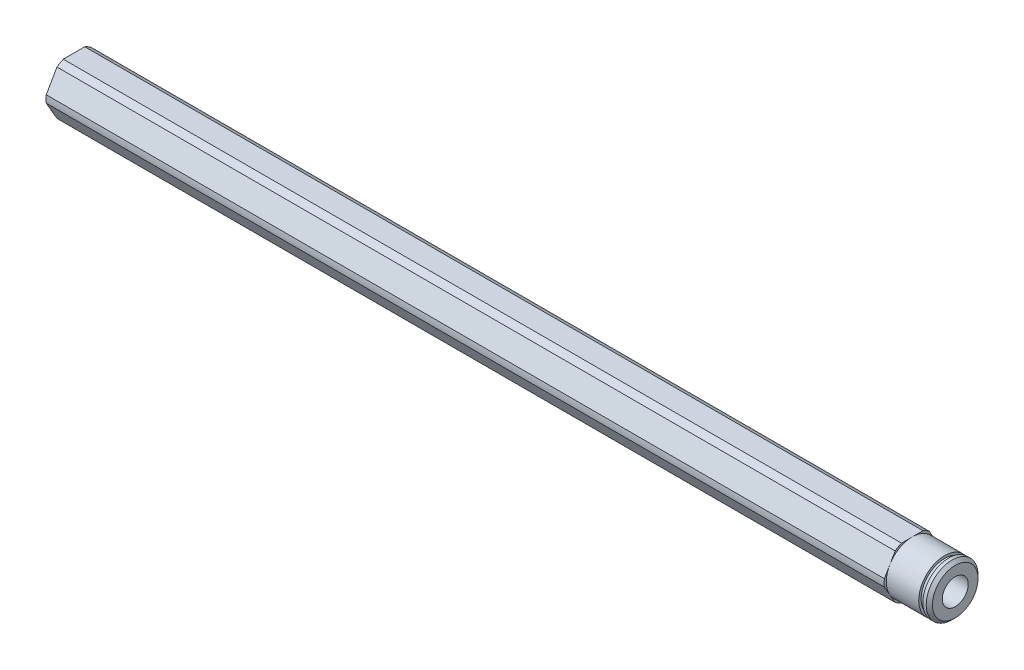
ISO-10303-21;
HEADER;
FILE_DESCRIPTION(('STEP AP214'),'2;1');
FILE_NAME('part.step','',(''),(''),'','','');
FILE_SCHEMA(('AUTOMOTIVE_DESIGN { 1 0 10303 214 1 1 1 1 }'));
ENDSEC;
DATA;
#1=APPLICATION_CONTEXT('core data for automotive mechanical design processes');
#2=APPLICATION_PROTOCOL_DEFINITION('international standard','automotive_design',2000,#1);
#3=PRODUCT_CONTEXT('',#1,'mechanical');
#4=PRODUCT('Part','Part','',(#3));
#5=PRODUCT_RELATED_PRODUCT_CATEGORY('part','',(#4));
#6=PRODUCT_DEFINITION_FORMATION('','',#4);
#7=PRODUCT_DEFINITION_CONTEXT('part definition',#1,'design');
#8=PRODUCT_DEFINITION('design','',#6,#7);
#9=PRODUCT_DEFINITION_SHAPE('','',#8);
#10=(LENGTH_UNIT() NAMED_UNIT(*) SI_UNIT(.MILLI.,.METRE.));
#11=(NAMED_UNIT(*) PLANE_ANGLE_UNIT() SI_UNIT($,.RADIAN.));
#12=(NAMED_UNIT(*) SI_UNIT($,.STERADIAN.) SOLID_ANGLE_UNIT());
#13=UNCERTAINTY_MEASURE_WITH_UNIT(LENGTH_MEASURE(1.E-05),#10,'distance_accuracy_value','');
#14=(GEOMETRIC_REPRESENTATION_CONTEXT(3) GLOBAL_UNCERTAINTY_ASSIGNED_CONTEXT((#13)) GLOBAL_UNIT_ASSIGNED_CONTEXT((#10,
#11,#12)) REPRESENTATION_CONTEXT('',''));
#15=CARTESIAN_POINT('',(0.,0.,0.));
#16=DIRECTION('',(0.,0.,1.));
#17=DIRECTION('',(1.,0.,0.));
#18=AXIS2_PLACEMENT_3D('',#15,#16,#17);
#19=CARTESIAN_POINT('',(-2.159,0.,0.));
#20=DIRECTION('',(1.,0.,0.));
#21=DIRECTION('',(0.,0.,-1.));
#22=AXIS2_PLACEMENT_3D('',#19,#20,#21);
#23=PLANE('',#22);
#24=CARTESIAN_POINT('',(-2.159,0.,0.));
#25=DIRECTION('',(1.,0.,0.));
#26=DIRECTION('',(0.,0.,-1.));
#27=AXIS2_PLACEMENT_3D('',#24,#25,#26);
#28=CIRCLE('',#27,3.175);
#29=CARTESIAN_POINT('',(-2.159,0.,-3.175));
#30=VERTEX_POINT('',#29);
#31=EDGE_CURVE('E20',#30,#30,#28,.T.);
#32=ORIENTED_EDGE('',*,*,#31,.T.);
#33=EDGE_LOOP('',(#32));
#34=FACE_BOUND('',#33,.T.);
#35=ADVANCED_FACE('F17',(#34),#23,.T.);
#36=CARTESIAN_POINT('',(-2.159,0.,0.));
#37=DIRECTION('',(1.,0.,0.));
#38=DIRECTION('',(0.,0.,-1.));
#39=AXIS2_PLACEMENT_3D('',#36,#37,#38);
#40=CYLINDRICAL_SURFACE('',#39,3.175);
#41=CARTESIAN_POINT('',(10.541,0.,0.));
#42=DIRECTION('',(1.,0.,0.));
#43=DIRECTION('',(0.,0.,-1.));
#44=AXIS2_PLACEMENT_3D('',#41,#42,#43);
#45=CIRCLE('',#44,3.175);
#46=CARTESIAN_POINT('',(10.541,0.,-3.175));
#47=VERTEX_POINT('',#46);
#48=EDGE_CURVE('E233',#47,#47,#45,.F.);
#49=ORIENTED_EDGE('',*,*,#48,.F.);
#50=EDGE_LOOP('',(#49));
#51=FACE_BOUND('',#50,.T.);
#52=ORIENTED_EDGE('',*,*,#31,.F.);
#53=EDGE_LOOP('',(#52));
#54=FACE_BOUND('',#53,.T.);
#55=ADVANCED_FACE('F241',(#51,#54),#40,.F.);
#56=CARTESIAN_POINT('',(10.541,0.,0.));
#57=DIRECTION('',(1.,0.,0.));
#58=DIRECTION('',(0.,0.,-1.));
#59=AXIS2_PLACEMENT_3D('',#56,#57,#58);
#60=PLANE('',#59);
#61=ORIENTED_EDGE('',*,*,#48,.T.);
#62=EDGE_LOOP('',(#61));
#63=FACE_BOUND('',#62,.T.);
#64=CARTESIAN_POINT('',(10.5410000000461,0.,0.));
#65=DIRECTION('',(-1.,0.,0.));
#66=DIRECTION('',(0.,0.,1.));
#67=AXIS2_PLACEMENT_3D('',#64,#65,#66);
#68=CIRCLE('',#67,5.58799999993198);
#69=CARTESIAN_POINT('',(10.5410000000461,0.,5.58799999993198));
#70=VERTEX_POINT('',#69);
#71=EDGE_CURVE('E176',#70,#70,#68,.T.);
#72=ORIENTED_EDGE('',*,*,#71,.F.);
#73=EDGE_LOOP('',(#72));
#74=FACE_BOUND('',#73,.T.);
#75=ADVANCED_FACE('F243',(#63,#74),#60,.T.);
#76=CARTESIAN_POINT('',(9.77900000009413,0.,0.));
#77=DIRECTION('',(-1.,0.,0.));
#78=DIRECTION('',(0.,0.,1.));
#79=AXIS2_PLACEMENT_3D('',#76,#77,#78);
#80=CONICAL_SURFACE('',#79,6.34999999988395,0.785398163397448);
#81=ORIENTED_EDGE('',*,*,#71,.T.);
#82=EDGE_LOOP('',(#81));
#83=FACE_BOUND('',#82,.T.);
#84=CARTESIAN_POINT('',(9.77899999999999,0.,0.));
#85=DIRECTION('',(-1.,0.,0.));
#86=DIRECTION('',(0.,0.,1.));
#87=AXIS2_PLACEMENT_3D('',#84,#85,#86);
#88=CIRCLE('',#87,6.35);
#89=CARTESIAN_POINT('',(9.77899999999999,0.,6.35));
#90=VERTEX_POINT('',#89);
#91=EDGE_CURVE('E172',#90,#90,#88,.T.);
#92=ORIENTED_EDGE('',*,*,#91,.F.);
#93=EDGE_LOOP('',(#92));
#94=FACE_BOUND('',#93,.T.);
#95=ADVANCED_FACE('F250',(#83,#94),#80,.T.);
#96=CARTESIAN_POINT('',(10.541,0.,0.));
#97=DIRECTION('',(-1.,0.,0.));
#98=DIRECTION('',(0.,0.,1.));
#99=AXIS2_PLACEMENT_3D('',#96,#97,#98);
#100=CYLINDRICAL_SURFACE('',#99,6.35);
#101=ORIENTED_EDGE('',*,*,#91,.T.);
#102=EDGE_LOOP('',(#101));
#103=FACE_BOUND('',#102,.T.);
#104=CARTESIAN_POINT('',(8.9535,0.,0.));
#105=DIRECTION('',(-1.,0.,0.));
#106=DIRECTION('',(0.,0.,1.));
#107=AXIS2_PLACEMENT_3D('',#104,#105,#106);
#108=CIRCLE('',#107,6.35);
#109=CARTESIAN_POINT('',(8.9535,0.,6.35));
#110=VERTEX_POINT('',#109);
#111=EDGE_CURVE('E175',#110,#110,#108,.F.);
#112=ORIENTED_EDGE('',*,*,#111,.T.);
#113=EDGE_LOOP('',(#112));
#114=FACE_BOUND('',#113,.T.);
#115=ADVANCED_FACE('F340',(#103,#114),#100,.T.);
#116=CARTESIAN_POINT('',(8.9535,0.,0.));
#117=DIRECTION('',(1.,0.,0.));
#118=DIRECTION('',(0.,0.,-1.));
#119=AXIS2_PLACEMENT_3D('',#116,#117,#118);
#120=PLANE('',#119);
#121=ORIENTED_EDGE('',*,*,#111,.F.);
#122=EDGE_LOOP('',(#121));
#123=FACE_BOUND('',#122,.T.);
#124=CARTESIAN_POINT('',(8.9535,0.,0.));
#125=DIRECTION('',(-1.,0.,0.));
#126=DIRECTION('',(0.,0.,1.));
#127=AXIS2_PLACEMENT_3D('',#124,#125,#126);
#128=CIRCLE('',#127,5.75);
#129=CARTESIAN_POINT('',(8.9535,0.,5.75));
#130=VERTEX_POINT('',#129);
#131=EDGE_CURVE('E227',#130,#130,#128,.T.);
#132=ORIENTED_EDGE('',*,*,#131,.F.);
#133=EDGE_LOOP('',(#132));
#134=FACE_BOUND('',#133,.T.);
#135=ADVANCED_FACE('F336',(#123,#134),#120,.F.);
#136=CARTESIAN_POINT('',(8.9535,0.,0.));
#137=DIRECTION('',(-1.,0.,0.));
#138=DIRECTION('',(0.,0.,1.));
#139=AXIS2_PLACEMENT_3D('',#136,#137,#138);
#140=CYLINDRICAL_SURFACE('',#139,5.75);
#141=CARTESIAN_POINT('',(7.9375,0.,0.));
#142=DIRECTION('',(-1.,0.,0.));
#143=DIRECTION('',(0.,0.,1.));
#144=AXIS2_PLACEMENT_3D('',#141,#142,#143);
#145=CIRCLE('',#144,5.75);
#146=CARTESIAN_POINT('',(7.9375,0.,5.75));
#147=VERTEX_POINT('',#146);
#148=EDGE_CURVE('E130',#147,#147,#145,.T.);
#149=ORIENTED_EDGE('',*,*,#148,.F.);
#150=EDGE_LOOP('',(#149));
#151=FACE_BOUND('',#150,.T.);
#152=ORIENTED_EDGE('',*,*,#131,.T.);
#153=EDGE_LOOP('',(#152));
#154=FACE_BOUND('',#153,.T.);
#155=ADVANCED_FACE('F332',(#151,#154),#140,.T.);
#156=CARTESIAN_POINT('',(0.,0.,0.));
#157=DIRECTION('',(-1.,0.,0.));
#158=DIRECTION('',(0.,0.,1.));
#159=AXIS2_PLACEMENT_3D('',#156,#157,#158);
#160=PLANE('',#159);
#161=DIRECTION('',(0.,0.,-1.));
#162=VECTOR('',#161,1.);
#163=CARTESIAN_POINT('',(0.,6.35000000000001,0.));
#164=LINE('',#163,#162);
#165=CARTESIAN_POINT('',(0.,6.35000000000001,-2.63498102459959));
#166=VERTEX_POINT('',#165);
#167=CARTESIAN_POINT('',(0.,6.35,0.));
#168=VERTEX_POINT('',#167);
#169=EDGE_CURVE('E129',#166,#168,#164,.F.);
#170=ORIENTED_EDGE('',*,*,#169,.T.);
#171=CARTESIAN_POINT('',(0.,0.,0.));
#172=DIRECTION('',(-1.,0.,0.));
#173=DIRECTION('',(0.,0.,1.));
#174=AXIS2_PLACEMENT_3D('',#171,#172,#173);
#175=CIRCLE('',#174,6.35);
#176=CARTESIAN_POINT('',(0.,3.175,-5.49926131403119));
#177=VERTEX_POINT('',#176);
#178=EDGE_CURVE('E218',#177,#168,#175,.F.);
#179=ORIENTED_EDGE('',*,*,#178,.F.);
#180=DIRECTION('',(0.,-0.866025403784439,-0.5));
#181=VECTOR('',#180,1.);
#182=CARTESIAN_POINT('',(0.,3.175,-5.49926131403119));
#183=LINE('',#182,#181);
#184=CARTESIAN_POINT('',(0.,5.45696050579321,-4.18177080173139));
#185=VERTEX_POINT('',#184);
#186=EDGE_CURVE('E164',#177,#185,#183,.F.);
#187=ORIENTED_EDGE('',*,*,#186,.T.);
#188=CARTESIAN_POINT('',(0.,0.,0.));
#189=DIRECTION('',(-1.,0.,0.));
#190=DIRECTION('',(0.,0.,1.));
#191=AXIS2_PLACEMENT_3D('',#188,#189,#190);
#192=CIRCLE('',#191,6.875);
#193=EDGE_CURVE('E165',#166,#185,#192,.T.);
#194=ORIENTED_EDGE('',*,*,#193,.F.);
#195=EDGE_LOOP('',(#170,#179,#187,#194));
#196=FACE_BOUND('',#195,.T.);
#197=ADVANCED_FACE('F329',(#196),#160,.F.);
#198=CARTESIAN_POINT('',(0.,0.,0.));
#199=DIRECTION('',(-1.,0.,0.));
#200=DIRECTION('',(0.,0.,1.));
#201=AXIS2_PLACEMENT_3D('',#198,#199,#200);
#202=PLANE('',#201);
#203=DIRECTION('',(0.,0.866025403784439,-0.5));
#204=VECTOR('',#203,1.);
#205=CARTESIAN_POINT('',(0.,3.175,5.49926131403118));
#206=LINE('',#205,#204);
#207=CARTESIAN_POINT('',(0.,5.45696050579321,4.18177080173138));
#208=VERTEX_POINT('',#207);
#209=CARTESIAN_POINT('',(0.,3.175,5.49926131403118));
#210=VERTEX_POINT('',#209);
#211=EDGE_CURVE('E122',#208,#210,#206,.F.);
#212=ORIENTED_EDGE('',*,*,#211,.T.);
#213=CARTESIAN_POINT('',(0.,0.,0.));
#214=DIRECTION('',(-1.,0.,0.));
#215=DIRECTION('',(0.,0.,1.));
#216=AXIS2_PLACEMENT_3D('',#213,#214,#215);
#217=CIRCLE('',#216,6.35);
#218=EDGE_CURVE('E215',#168,#210,#217,.F.);
#219=ORIENTED_EDGE('',*,*,#218,.F.);
#220=DIRECTION('',(0.,0.,-1.));
#221=VECTOR('',#220,1.);
#222=CARTESIAN_POINT('',(0.,6.35000000000001,0.));
#223=LINE('',#222,#221);
#224=CARTESIAN_POINT('',(0.,6.35000000000001,2.63498102459959));
#225=VERTEX_POINT('',#224);
#226=EDGE_CURVE('E124',#168,#225,#223,.F.);
#227=ORIENTED_EDGE('',*,*,#226,.T.);
#228=CARTESIAN_POINT('',(0.,0.,0.));
#229=DIRECTION('',(-1.,0.,0.));
#230=DIRECTION('',(0.,0.,1.));
#231=AXIS2_PLACEMENT_3D('',#228,#229,#230);
#232=CIRCLE('',#231,6.875);
#233=EDGE_CURVE('E118',#208,#225,#232,.T.);
#234=ORIENTED_EDGE('',*,*,#233,.F.);
#235=EDGE_LOOP('',(#212,#219,#227,#234));
#236=FACE_BOUND('',#235,.T.);
#237=ADVANCED_FACE('F120',(#236),#202,.F.);
#238=CARTESIAN_POINT('',(7.9375,0.,0.));
#239=DIRECTION('',(1.,0.,0.));
#240=DIRECTION('',(0.,0.,-1.));
#241=AXIS2_PLACEMENT_3D('',#238,#239,#240);
#242=PLANE('',#241);
#243=CARTESIAN_POINT('',(7.9375,0.,0.));
#244=DIRECTION('',(-1.,0.,0.));
#245=DIRECTION('',(0.,0.,1.));
#246=AXIS2_PLACEMENT_3D('',#243,#244,#245);
#247=CIRCLE('',#246,6.35);
#248=CARTESIAN_POINT('',(7.9375,0.,6.35));
#249=VERTEX_POINT('',#248);
#250=EDGE_CURVE('E212',#249,#249,#247,.T.);
#251=ORIENTED_EDGE('',*,*,#250,.F.);
#252=EDGE_LOOP('',(#251));
#253=FACE_BOUND('',#252,.T.);
#254=ORIENTED_EDGE('',*,*,#148,.T.);
#255=EDGE_LOOP('',(#254));
#256=FACE_BOUND('',#255,.T.);
#257=ADVANCED_FACE('F322',(#253,#256),#242,.T.);
#258=CARTESIAN_POINT('',(0.,0.,0.));
#259=DIRECTION('',(-1.,0.,0.));
#260=DIRECTION('',(0.,0.,1.));
#261=AXIS2_PLACEMENT_3D('',#258,#259,#260);
#262=PLANE('',#261);
#263=DIRECTION('',(0.,-0.866025403784439,-0.5));
#264=VECTOR('',#263,1.);
#265=CARTESIAN_POINT('',(0.,3.175,-5.49926131403119));
#266=LINE('',#265,#264);
#267=CARTESIAN_POINT('',(0.,0.893039494206796,-6.81675182633099));
#268=VERTEX_POINT('',#267);
#269=EDGE_CURVE('E161',#268,#177,#266,.F.);
#270=ORIENTED_EDGE('',*,*,#269,.T.);
#271=CARTESIAN_POINT('',(0.,0.,0.));
#272=DIRECTION('',(-1.,0.,0.));
#273=DIRECTION('',(0.,0.,1.));
#274=AXIS2_PLACEMENT_3D('',#271,#272,#273);
#275=CIRCLE('',#274,6.35);
#276=CARTESIAN_POINT('',(0.,-3.175,-5.49926131403119));
#277=VERTEX_POINT('',#276);
#278=EDGE_CURVE('E206',#277,#177,#275,.F.);
#279=ORIENTED_EDGE('',*,*,#278,.F.);
#280=DIRECTION('',(0.,-0.866025403784439,0.5));
#281=VECTOR('',#280,1.);
#282=CARTESIAN_POINT('',(0.,-3.175,-5.49926131403119));
#283=LINE('',#282,#281);
#284=CARTESIAN_POINT('',(0.,-0.893039494206809,-6.81675182633099));
#285=VERTEX_POINT('',#284);
#286=EDGE_CURVE('E156',#277,#285,#283,.F.);
#287=ORIENTED_EDGE('',*,*,#286,.T.);
#288=CARTESIAN_POINT('',(0.,0.,0.));
#289=DIRECTION('',(-1.,0.,0.));
#290=DIRECTION('',(0.,0.,1.));
#291=AXIS2_PLACEMENT_3D('',#288,#289,#290);
#292=CIRCLE('',#291,6.875);
#293=EDGE_CURVE('E157',#268,#285,#292,.T.);
#294=ORIENTED_EDGE('',*,*,#293,.F.);
#295=EDGE_LOOP('',(#270,#279,#287,#294));
#296=FACE_BOUND('',#295,.T.);
#297=ADVANCED_FACE('F318',(#296),#262,.F.);
#298=CARTESIAN_POINT('',(0.,0.,0.));
#299=DIRECTION('',(-1.,0.,0.));
#300=DIRECTION('',(0.,0.,1.));
#301=AXIS2_PLACEMENT_3D('',#298,#299,#300);
#302=PLANE('',#301);
#303=DIRECTION('',(0.,-0.866025403784439,0.5));
#304=VECTOR('',#303,1.);
#305=CARTESIAN_POINT('',(0.,-3.175,-5.49926131403119));
#306=LINE('',#305,#304);
#307=CARTESIAN_POINT('',(0.,-5.4569605057932,-4.18177080173139));
#308=VERTEX_POINT('',#307);
#309=EDGE_CURVE('E153',#308,#277,#306,.F.);
#310=ORIENTED_EDGE('',*,*,#309,.T.);
#311=CARTESIAN_POINT('',(0.,0.,0.));
#312=DIRECTION('',(-1.,0.,0.));
#313=DIRECTION('',(0.,0.,1.));
#314=AXIS2_PLACEMENT_3D('',#311,#312,#313);
#315=CIRCLE('',#314,6.35);
#316=CARTESIAN_POINT('',(0.,-6.35,0.));
#317=VERTEX_POINT('',#316);
#318=EDGE_CURVE('E209',#317,#277,#315,.F.);
#319=ORIENTED_EDGE('',*,*,#318,.F.);
#320=DIRECTION('',(0.,0.,1.));
#321=VECTOR('',#320,1.);
#322=CARTESIAN_POINT('',(0.,-6.35,0.));
#323=LINE('',#322,#321);
#324=CARTESIAN_POINT('',(0.,-6.35,-2.6349810245996));
#325=VERTEX_POINT('',#324);
#326=EDGE_CURVE('E208',#317,#325,#323,.F.);
#327=ORIENTED_EDGE('',*,*,#326,.T.);
#328=CARTESIAN_POINT('',(0.,0.,0.));
#329=DIRECTION('',(-1.,0.,0.));
#330=DIRECTION('',(0.,0.,1.));
#331=AXIS2_PLACEMENT_3D('',#328,#329,#330);
#332=CIRCLE('',#331,6.875);
#333=EDGE_CURVE('E145',#308,#325,#332,.T.);
#334=ORIENTED_EDGE('',*,*,#333,.F.);
#335=EDGE_LOOP('',(#310,#319,#327,#334));
#336=FACE_BOUND('',#335,.T.);
#337=ADVANCED_FACE('F315',(#336),#302,.F.);
#338=CARTESIAN_POINT('',(10.541,0.,0.));
#339=DIRECTION('',(-1.,0.,0.));
#340=DIRECTION('',(0.,0.,1.));
#341=AXIS2_PLACEMENT_3D('',#338,#339,#340);
#342=CYLINDRICAL_SURFACE('',#341,6.875);
#343=DIRECTION('',(1.,0.,0.));
#344=VECTOR('',#343,1.);
#345=CARTESIAN_POINT('',(-205.359,6.35000000000001,2.63498102459959));
#346=LINE('',#345,#344);
#347=CARTESIAN_POINT('',(-205.359,6.35000000000001,2.63498102459959));
#348=VERTEX_POINT('',#347);
#349=EDGE_CURVE('E151',#225,#348,#346,.F.);
#350=ORIENTED_EDGE('',*,*,#349,.T.);
#351=CARTESIAN_POINT('',(-205.359,0.,0.));
#352=DIRECTION('',(-1.,0.,0.));
#353=DIRECTION('',(0.,0.,1.));
#354=AXIS2_PLACEMENT_3D('',#351,#352,#353);
#355=CIRCLE('',#354,6.875);
#356=CARTESIAN_POINT('',(-205.359,5.45696050579321,4.18177080173138));
#357=VERTEX_POINT('',#356);
#358=EDGE_CURVE('E144',#357,#348,#355,.T.);
#359=ORIENTED_EDGE('',*,*,#358,.F.);
#360=DIRECTION('',(1.,0.,0.));
#361=VECTOR('',#360,1.);
#362=CARTESIAN_POINT('',(-205.359,5.45696050579321,4.18177080173138));
#363=LINE('',#362,#361);
#364=EDGE_CURVE('E135',#357,#208,#363,.T.);
#365=ORIENTED_EDGE('',*,*,#364,.T.);
#366=ORIENTED_EDGE('',*,*,#233,.T.);
#367=EDGE_LOOP('',(#350,#359,#365,#366));
#368=FACE_BOUND('',#367,.T.);
#369=ADVANCED_FACE('F143',(#368),#342,.T.);
#370=CARTESIAN_POINT('',(-205.359,6.35000000000001,0.));
#371=DIRECTION('',(0.,-1.,0.));
#372=DIRECTION('',(0.,0.,-1.));
#373=AXIS2_PLACEMENT_3D('',#370,#371,#372);
#374=PLANE('',#373);
#375=ORIENTED_EDGE('',*,*,#226,.F.);
#376=ORIENTED_EDGE('',*,*,#169,.F.);
#377=DIRECTION('',(-1.,0.,0.));
#378=VECTOR('',#377,1.);
#379=CARTESIAN_POINT('',(10.541,6.35000000000001,-2.63498102459959));
#380=LINE('',#379,#378);
#381=CARTESIAN_POINT('',(-205.359,6.35000000000001,-2.63498102459959));
#382=VERTEX_POINT('',#381);
#383=EDGE_CURVE('E223',#382,#166,#380,.F.);
#384=ORIENTED_EDGE('',*,*,#383,.F.);
#385=DIRECTION('',(0.,0.,1.));
#386=VECTOR('',#385,1.);
#387=CARTESIAN_POINT('',(-205.359,6.35000000000001,0.));
#388=LINE('',#387,#386);
#389=EDGE_CURVE('E203',#348,#382,#388,.F.);
#390=ORIENTED_EDGE('',*,*,#389,.F.);
#391=ORIENTED_EDGE('',*,*,#349,.F.);
#392=EDGE_LOOP('',(#375,#376,#384,#390,#391));
#393=FACE_BOUND('',#392,.T.);
#394=ADVANCED_FACE('F308',(#393),#374,.F.);
#395=CARTESIAN_POINT('',(10.541,0.,0.));
#396=DIRECTION('',(-1.,0.,0.));
#397=DIRECTION('',(0.,0.,1.));
#398=AXIS2_PLACEMENT_3D('',#395,#396,#397);
#399=CYLINDRICAL_SURFACE('',#398,6.875);
#400=DIRECTION('',(1.,0.,0.));
#401=VECTOR('',#400,1.);
#402=CARTESIAN_POINT('',(-205.359,5.45696050579321,-4.18177080173139));
#403=LINE('',#402,#401);
#404=CARTESIAN_POINT('',(-205.359,5.45696050579321,-4.18177080173139));
#405=VERTEX_POINT('',#404);
#406=EDGE_CURVE('E168',#185,#405,#403,.F.);
#407=ORIENTED_EDGE('',*,*,#406,.T.);
#408=CARTESIAN_POINT('',(-205.359,0.,0.));
#409=DIRECTION('',(-1.,0.,0.));
#410=DIRECTION('',(0.,0.,1.));
#411=AXIS2_PLACEMENT_3D('',#408,#409,#410);
#412=CIRCLE('',#411,6.875);
#413=EDGE_CURVE('E201',#382,#405,#412,.T.);
#414=ORIENTED_EDGE('',*,*,#413,.F.);
#415=ORIENTED_EDGE('',*,*,#383,.T.);
#416=ORIENTED_EDGE('',*,*,#193,.T.);
#417=EDGE_LOOP('',(#407,#414,#415,#416));
#418=FACE_BOUND('',#417,.T.);
#419=ADVANCED_FACE('F304',(#418),#399,.T.);
#420=CARTESIAN_POINT('',(-205.359,3.175,-5.49926131403119));
#421=DIRECTION('',(0.,-0.5,0.866025403784439));
#422=DIRECTION('',(0.,-0.866025403784439,-0.5));
#423=AXIS2_PLACEMENT_3D('',#420,#421,#422);
#424=PLANE('',#423);
#425=ORIENTED_EDGE('',*,*,#186,.F.);
#426=ORIENTED_EDGE('',*,*,#269,.F.);
#427=DIRECTION('',(-1.,0.,0.));
#428=VECTOR('',#427,1.);
#429=CARTESIAN_POINT('',(10.541,0.893039494206796,-6.81675182633099));
#430=LINE('',#429,#428);
#431=CARTESIAN_POINT('',(-205.359,0.893039494206795,-6.81675182633099));
#432=VERTEX_POINT('',#431);
#433=EDGE_CURVE('E222',#432,#268,#430,.F.);
#434=ORIENTED_EDGE('',*,*,#433,.F.);
#435=DIRECTION('',(0.,-0.866025403784439,-0.5));
#436=VECTOR('',#435,1.);
#437=CARTESIAN_POINT('',(-205.359,5.4569605057932,-4.18177080173139));
#438=LINE('',#437,#436);
#439=EDGE_CURVE('E200',#405,#432,#438,.T.);
#440=ORIENTED_EDGE('',*,*,#439,.F.);
#441=ORIENTED_EDGE('',*,*,#406,.F.);
#442=EDGE_LOOP('',(#425,#426,#434,#440,#441));
#443=FACE_BOUND('',#442,.T.);
#444=ADVANCED_FACE('F300',(#443),#424,.F.);
#445=CARTESIAN_POINT('',(10.541,0.,0.));
#446=DIRECTION('',(-1.,0.,0.));
#447=DIRECTION('',(0.,0.,1.));
#448=AXIS2_PLACEMENT_3D('',#445,#446,#447);
#449=CYLINDRICAL_SURFACE('',#448,6.875);
#450=DIRECTION('',(1.,0.,0.));
#451=VECTOR('',#450,1.);
#452=CARTESIAN_POINT('',(-205.359,-0.893039494206809,-6.81675182633099));
#453=LINE('',#452,#451);
#454=CARTESIAN_POINT('',(-205.359,-0.89303949420681,-6.81675182633099));
#455=VERTEX_POINT('',#454);
#456=EDGE_CURVE('E160',#285,#455,#453,.F.);
#457=ORIENTED_EDGE('',*,*,#456,.T.);
#458=CARTESIAN_POINT('',(-205.359,0.,0.));
#459=DIRECTION('',(-1.,0.,0.));
#460=DIRECTION('',(0.,0.,1.));
#461=AXIS2_PLACEMENT_3D('',#458,#459,#460);
#462=CIRCLE('',#461,6.875);
#463=EDGE_CURVE('E198',#432,#455,#462,.T.);
#464=ORIENTED_EDGE('',*,*,#463,.F.);
#465=ORIENTED_EDGE('',*,*,#433,.T.);
#466=ORIENTED_EDGE('',*,*,#293,.T.);
#467=EDGE_LOOP('',(#457,#464,#465,#466));
#468=FACE_BOUND('',#467,.T.);
#469=ADVANCED_FACE('F296',(#468),#449,.T.);
#470=CARTESIAN_POINT('',(-205.359,-3.175,-5.49926131403119));
#471=DIRECTION('',(0.,0.5,0.866025403784439));
#472=DIRECTION('',(0.,-0.866025403784439,0.5));
#473=AXIS2_PLACEMENT_3D('',#470,#471,#472);
#474=PLANE('',#473);
#475=ORIENTED_EDGE('',*,*,#286,.F.);
#476=ORIENTED_EDGE('',*,*,#309,.F.);
#477=DIRECTION('',(-1.,0.,0.));
#478=VECTOR('',#477,1.);
#479=CARTESIAN_POINT('',(10.541,-5.4569605057932,-4.1817708017314));
#480=LINE('',#479,#478);
#481=CARTESIAN_POINT('',(-205.359,-5.4569605057932,-4.18177080173139));
#482=VERTEX_POINT('',#481);
#483=EDGE_CURVE('E147',#482,#308,#480,.F.);
#484=ORIENTED_EDGE('',*,*,#483,.F.);
#485=DIRECTION('',(0.,-0.866025403784438,0.5));
#486=VECTOR('',#485,1.);
#487=CARTESIAN_POINT('',(-205.359,-0.89303949420681,-6.81675182633099));
#488=LINE('',#487,#486);
#489=EDGE_CURVE('E197',#455,#482,#488,.T.);
#490=ORIENTED_EDGE('',*,*,#489,.F.);
#491=ORIENTED_EDGE('',*,*,#456,.F.);
#492=EDGE_LOOP('',(#475,#476,#484,#490,#491));
#493=FACE_BOUND('',#492,.T.);
#494=ADVANCED_FACE('F292',(#493),#474,.F.);
#495=CARTESIAN_POINT('',(10.541,0.,0.));
#496=DIRECTION('',(-1.,0.,0.));
#497=DIRECTION('',(0.,0.,1.));
#498=AXIS2_PLACEMENT_3D('',#495,#496,#497);
#499=CYLINDRICAL_SURFACE('',#498,6.875);
#500=DIRECTION('',(1.,0.,0.));
#501=VECTOR('',#500,1.);
#502=CARTESIAN_POINT('',(-205.359,-6.35,-2.6349810245996));
#503=LINE('',#502,#501);
#504=CARTESIAN_POINT('',(-205.359,-6.35,-2.6349810245996));
#505=VERTEX_POINT('',#504);
#506=EDGE_CURVE('E545',#325,#505,#503,.F.);
#507=ORIENTED_EDGE('',*,*,#506,.T.);
#508=CARTESIAN_POINT('',(-205.359,0.,0.));
#509=DIRECTION('',(-1.,0.,0.));
#510=DIRECTION('',(0.,0.,1.));
#511=AXIS2_PLACEMENT_3D('',#508,#509,#510);
#512=CIRCLE('',#511,6.875);
#513=EDGE_CURVE('E195',#482,#505,#512,.T.);
#514=ORIENTED_EDGE('',*,*,#513,.F.);
#515=ORIENTED_EDGE('',*,*,#483,.T.);
#516=ORIENTED_EDGE('',*,*,#333,.T.);
#517=EDGE_LOOP('',(#507,#514,#515,#516));
#518=FACE_BOUND('',#517,.T.);
#519=ADVANCED_FACE('F289',(#518),#499,.T.);
#520=CARTESIAN_POINT('',(-205.359,3.175,5.49926131403118));
#521=DIRECTION('',(0.,-0.5,-0.866025403784439));
#522=DIRECTION('',(0.,0.866025403784439,-0.5));
#523=AXIS2_PLACEMENT_3D('',#520,#521,#522);
#524=PLANE('',#523);
#525=DIRECTION('',(0.,0.866025403784438,-0.500000000000001));
#526=VECTOR('',#525,1.);
#527=CARTESIAN_POINT('',(0.,0.893039494206791,6.81675182633099));
#528=LINE('',#527,#526);
#529=CARTESIAN_POINT('',(0.,0.893039494206794,6.81675182633099));
#530=VERTEX_POINT('',#529);
#531=EDGE_CURVE('E139',#530,#210,#528,.T.);
#532=ORIENTED_EDGE('',*,*,#531,.T.);
#533=ORIENTED_EDGE('',*,*,#211,.F.);
#534=ORIENTED_EDGE('',*,*,#364,.F.);
#535=DIRECTION('',(0.,0.866025403784438,-0.5));
#536=VECTOR('',#535,1.);
#537=CARTESIAN_POINT('',(-205.359,0.893039494206791,6.81675182633099));
#538=LINE('',#537,#536);
#539=CARTESIAN_POINT('',(-205.359,0.893039494206793,6.81675182633099));
#540=VERTEX_POINT('',#539);
#541=EDGE_CURVE('E205',#540,#357,#538,.T.);
#542=ORIENTED_EDGE('',*,*,#541,.F.);
#543=DIRECTION('',(1.,0.,0.));
#544=VECTOR('',#543,1.);
#545=CARTESIAN_POINT('',(-205.359,0.893039494206789,6.81675182633099));
#546=LINE('',#545,#544);
#547=EDGE_CURVE('E140',#530,#540,#546,.F.);
#548=ORIENTED_EDGE('',*,*,#547,.F.);
#549=EDGE_LOOP('',(#532,#533,#534,#542,#548));
#550=FACE_BOUND('',#549,.T.);
#551=ADVANCED_FACE('F133',(#550),#524,.F.);
#552=CARTESIAN_POINT('',(7.9375,0.,0.));
#553=DIRECTION('',(-1.,0.,0.));
#554=DIRECTION('',(0.,0.,1.));
#555=AXIS2_PLACEMENT_3D('',#552,#553,#554);
#556=CYLINDRICAL_SURFACE('',#555,6.35);
#557=ORIENTED_EDGE('',*,*,#250,.T.);
#558=EDGE_LOOP('',(#557));
#559=FACE_BOUND('',#558,.T.);
#560=ORIENTED_EDGE('',*,*,#318,.T.);
#561=ORIENTED_EDGE('',*,*,#278,.T.);
#562=ORIENTED_EDGE('',*,*,#178,.T.);
#563=ORIENTED_EDGE('',*,*,#218,.T.);
#564=CARTESIAN_POINT('',(0.,0.,0.));
#565=DIRECTION('',(-1.,0.,0.));
#566=DIRECTION('',(0.,0.,1.));
#567=AXIS2_PLACEMENT_3D('',#564,#565,#566);
#568=CIRCLE('',#567,6.35);
#569=CARTESIAN_POINT('',(0.,-3.175,5.49926131403119));
#570=VERTEX_POINT('',#569);
#571=EDGE_CURVE('E189',#210,#570,#568,.F.);
#572=ORIENTED_EDGE('',*,*,#571,.T.);
#573=CARTESIAN_POINT('',(0.,0.,0.));
#574=DIRECTION('',(-1.,0.,0.));
#575=DIRECTION('',(0.,0.,1.));
#576=AXIS2_PLACEMENT_3D('',#573,#574,#575);
#577=CIRCLE('',#576,6.35);
#578=EDGE_CURVE('E183',#570,#317,#577,.F.);
#579=ORIENTED_EDGE('',*,*,#578,.T.);
#580=EDGE_LOOP('',(#560,#561,#562,#563,#572,#579));
#581=FACE_BOUND('',#580,.T.);
#582=ADVANCED_FACE('F282',(#559,#581),#556,.T.);
#583=CARTESIAN_POINT('',(-205.359,-6.35,0.));
#584=DIRECTION('',(0.,1.,0.));
#585=DIRECTION('',(0.,0.,1.));
#586=AXIS2_PLACEMENT_3D('',#583,#584,#585);
#587=PLANE('',#586);
#588=ORIENTED_EDGE('',*,*,#326,.F.);
#589=DIRECTION('',(0.,0.,1.));
#590=VECTOR('',#589,1.);
#591=CARTESIAN_POINT('',(0.,-6.35,0.));
#592=LINE('',#591,#590);
#593=CARTESIAN_POINT('',(0.,-6.35,2.6349810245996));
#594=VERTEX_POINT('',#593);
#595=EDGE_CURVE('E186',#317,#594,#592,.T.);
#596=ORIENTED_EDGE('',*,*,#595,.T.);
#597=DIRECTION('',(-1.,0.,0.));
#598=VECTOR('',#597,1.);
#599=CARTESIAN_POINT('',(10.541,-6.35,2.6349810245996));
#600=LINE('',#599,#598);
#601=CARTESIAN_POINT('',(-205.359,-6.35,2.6349810245996));
#602=VERTEX_POINT('',#601);
#603=EDGE_CURVE('E182',#602,#594,#600,.F.);
#604=ORIENTED_EDGE('',*,*,#603,.F.);
#605=DIRECTION('',(0.,0.,1.));
#606=VECTOR('',#605,1.);
#607=CARTESIAN_POINT('',(-205.359,-6.35,0.));
#608=LINE('',#607,#606);
#609=EDGE_CURVE('E194',#505,#602,#608,.T.);
#610=ORIENTED_EDGE('',*,*,#609,.F.);
#611=ORIENTED_EDGE('',*,*,#506,.F.);
#612=EDGE_LOOP('',(#588,#596,#604,#610,#611));
#613=FACE_BOUND('',#612,.T.);
#614=ADVANCED_FACE('F278',(#613),#587,.F.);
#615=CARTESIAN_POINT('',(-205.359,0.,0.));
#616=DIRECTION('',(-1.,0.,0.));
#617=DIRECTION('',(0.,0.,1.));
#618=AXIS2_PLACEMENT_3D('',#615,#616,#617);
#619=PLANE('',#618);
#620=CARTESIAN_POINT('',(-205.359,0.,0.));
#621=DIRECTION('',(-1.,0.,0.));
#622=DIRECTION('',(0.,0.,1.));
#623=AXIS2_PLACEMENT_3D('',#620,#621,#622);
#624=CIRCLE('',#623,6.875);
#625=CARTESIAN_POINT('',(-205.359,-0.893039494206788,6.81675182633099));
#626=VERTEX_POINT('',#625);
#627=EDGE_CURVE('E192',#540,#626,#624,.F.);
#628=ORIENTED_EDGE('',*,*,#627,.F.);
#629=ORIENTED_EDGE('',*,*,#541,.T.);
#630=ORIENTED_EDGE('',*,*,#358,.T.);
#631=ORIENTED_EDGE('',*,*,#389,.T.);
#632=ORIENTED_EDGE('',*,*,#413,.T.);
#633=ORIENTED_EDGE('',*,*,#439,.T.);
#634=ORIENTED_EDGE('',*,*,#463,.T.);
#635=ORIENTED_EDGE('',*,*,#489,.T.);
#636=ORIENTED_EDGE('',*,*,#513,.T.);
#637=ORIENTED_EDGE('',*,*,#609,.T.);
#638=CARTESIAN_POINT('',(-205.359,0.,0.));
#639=DIRECTION('',(-1.,0.,0.));
#640=DIRECTION('',(0.,0.,1.));
#641=AXIS2_PLACEMENT_3D('',#638,#639,#640);
#642=CIRCLE('',#641,6.875);
#643=CARTESIAN_POINT('',(-205.359,-5.45696050579321,4.18177080173138));
#644=VERTEX_POINT('',#643);
#645=EDGE_CURVE('E177',#644,#602,#642,.F.);
#646=ORIENTED_EDGE('',*,*,#645,.F.);
#647=DIRECTION('',(0.,0.866025403784439,0.5));
#648=VECTOR('',#647,1.);
#649=CARTESIAN_POINT('',(-205.359,-3.175,5.49926131403119));
#650=LINE('',#649,#648);
#651=EDGE_CURVE('E180',#644,#626,#650,.T.);
#652=ORIENTED_EDGE('',*,*,#651,.T.);
#653=EDGE_LOOP('',(#628,#629,#630,#631,#632,#633,#634,#635,#636,#637,#646,#652));
#654=FACE_BOUND('',#653,.T.);
#655=ADVANCED_FACE('F274',(#654),#619,.T.);
#656=CARTESIAN_POINT('',(10.541,0.,0.));
#657=DIRECTION('',(-1.,0.,0.));
#658=DIRECTION('',(0.,0.,1.));
#659=AXIS2_PLACEMENT_3D('',#656,#657,#658);
#660=CYLINDRICAL_SURFACE('',#659,6.875);
#661=ORIENTED_EDGE('',*,*,#627,.T.);
#662=DIRECTION('',(1.,0.,0.));
#663=VECTOR('',#662,1.);
#664=CARTESIAN_POINT('',(-205.359,-0.893039494206788,6.81675182633099));
#665=LINE('',#664,#663);
#666=CARTESIAN_POINT('',(0.,-0.893039494206788,6.81675182633099));
#667=VERTEX_POINT('',#666);
#668=EDGE_CURVE('E561',#626,#667,#665,.T.);
#669=ORIENTED_EDGE('',*,*,#668,.T.);
#670=CARTESIAN_POINT('',(0.,0.,0.));
#671=DIRECTION('',(-1.,0.,0.));
#672=DIRECTION('',(0.,0.,1.));
#673=AXIS2_PLACEMENT_3D('',#670,#671,#672);
#674=CIRCLE('',#673,6.875);
#675=EDGE_CURVE('E187',#667,#530,#674,.T.);
#676=ORIENTED_EDGE('',*,*,#675,.T.);
#677=ORIENTED_EDGE('',*,*,#547,.T.);
#678=EDGE_LOOP('',(#661,#669,#676,#677));
#679=FACE_BOUND('',#678,.T.);
#680=ADVANCED_FACE('F270',(#679),#660,.T.);
#681=CARTESIAN_POINT('',(0.,0.,0.));
#682=DIRECTION('',(-1.,0.,0.));
#683=DIRECTION('',(0.,0.,1.));
#684=AXIS2_PLACEMENT_3D('',#681,#682,#683);
#685=PLANE('',#684);
#686=DIRECTION('',(0.,0.866025403784439,0.5));
#687=VECTOR('',#686,1.);
#688=CARTESIAN_POINT('',(1.11022302462516E-13,-3.175,5.49926131403119));
#689=LINE('',#688,#687);
#690=EDGE_CURVE('E564',#667,#570,#689,.F.);
#691=ORIENTED_EDGE('',*,*,#690,.T.);
#692=ORIENTED_EDGE('',*,*,#571,.F.);
#693=ORIENTED_EDGE('',*,*,#531,.F.);
#694=ORIENTED_EDGE('',*,*,#675,.F.);
#695=EDGE_LOOP('',(#691,#692,#693,#694));
#696=FACE_BOUND('',#695,.T.);
#697=ADVANCED_FACE('F266',(#696),#685,.F.);
#698=CARTESIAN_POINT('',(0.,0.,0.));
#699=DIRECTION('',(-1.,0.,0.));
#700=DIRECTION('',(0.,0.,1.));
#701=AXIS2_PLACEMENT_3D('',#698,#699,#700);
#702=PLANE('',#701);
#703=ORIENTED_EDGE('',*,*,#595,.F.);
#704=ORIENTED_EDGE('',*,*,#578,.F.);
#705=DIRECTION('',(0.,0.866025403784439,0.5));
#706=VECTOR('',#705,1.);
#707=CARTESIAN_POINT('',(1.11022302462516E-13,-3.175,5.49926131403119));
#708=LINE('',#707,#706);
#709=CARTESIAN_POINT('',(0.,-5.45696050579321,4.18177080173138));
#710=VERTEX_POINT('',#709);
#711=EDGE_CURVE('E26',#570,#710,#708,.F.);
#712=ORIENTED_EDGE('',*,*,#711,.T.);
#713=CARTESIAN_POINT('',(0.,0.,0.));
#714=DIRECTION('',(-1.,0.,0.));
#715=DIRECTION('',(0.,0.,1.));
#716=AXIS2_PLACEMENT_3D('',#713,#714,#715);
#717=CIRCLE('',#716,6.875);
#718=EDGE_CURVE('E34',#594,#710,#717,.T.);
#719=ORIENTED_EDGE('',*,*,#718,.F.);
#720=EDGE_LOOP('',(#703,#704,#712,#719));
#721=FACE_BOUND('',#720,.T.);
#722=ADVANCED_FACE('F260',(#721),#702,.F.);
#723=CARTESIAN_POINT('',(10.541,0.,0.));
#724=DIRECTION('',(-1.,0.,0.));
#725=DIRECTION('',(0.,0.,1.));
#726=AXIS2_PLACEMENT_3D('',#723,#724,#725);
#727=CYLINDRICAL_SURFACE('',#726,6.875);
#728=DIRECTION('',(1.,0.,0.));
#729=VECTOR('',#728,1.);
#730=CARTESIAN_POINT('',(-205.359,-5.45696050579321,4.18177080173138));
#731=LINE('',#730,#729);
#732=EDGE_CURVE('E11',#710,#644,#731,.F.);
#733=ORIENTED_EDGE('',*,*,#732,.T.);
#734=ORIENTED_EDGE('',*,*,#645,.T.);
#735=ORIENTED_EDGE('',*,*,#603,.T.);
#736=ORIENTED_EDGE('',*,*,#718,.T.);
#737=EDGE_LOOP('',(#733,#734,#735,#736));
#738=FACE_BOUND('',#737,.T.);
#739=ADVANCED_FACE('F254',(#738),#727,.T.);
#740=CARTESIAN_POINT('',(-205.359,-3.175,5.49926131403119));
#741=DIRECTION('',(0.,0.5,-0.866025403784439));
#742=DIRECTION('',(0.,0.866025403784439,0.5));
#743=AXIS2_PLACEMENT_3D('',#740,#741,#742);
#744=PLANE('',#743);
#745=ORIENTED_EDGE('',*,*,#711,.F.);
#746=ORIENTED_EDGE('',*,*,#690,.F.);
#747=ORIENTED_EDGE('',*,*,#668,.F.);
#748=ORIENTED_EDGE('',*,*,#651,.F.);
#749=ORIENTED_EDGE('',*,*,#732,.F.);
#750=EDGE_LOOP('',(#745,#746,#747,#748,#749));
#751=FACE_BOUND('',#750,.T.);
#752=ADVANCED_FACE('F252',(#751),#744,.F.);
#753=CLOSED_SHELL('',(#35,#55,#75,#95,#115,#135,#155,#197,#237,#257,#297,#337,#369,#394,#419,
#444,#469,#494,#519,#551,#582,#614,#655,#680,#697,#722,#739,#752));
#754=MANIFOLD_SOLID_BREP('B1',#753);
#755=ADVANCED_BREP_SHAPE_REPRESENTATION('',(#18,#754),#14);
#756=SHAPE_DEFINITION_REPRESENTATION(#9,#755);
ENDSEC;
END-ISO-10303-21;
